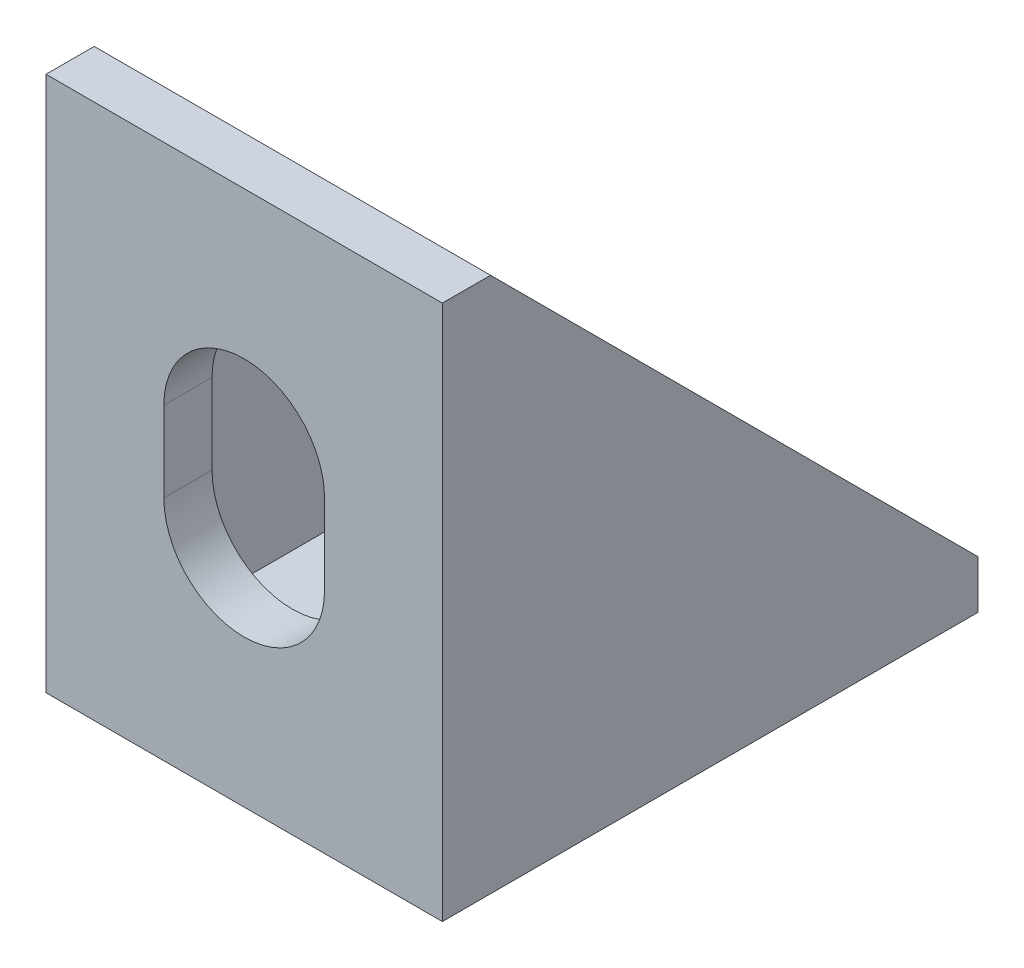
ISO-10303-21;
HEADER;
FILE_DESCRIPTION(('STEP AP214'),'2;1');
FILE_NAME('part.step','',(''),(''),'','','');
FILE_SCHEMA(('AUTOMOTIVE_DESIGN { 1 0 10303 214 1 1 1 1 }'));
ENDSEC;
DATA;
#1=APPLICATION_CONTEXT('core data for automotive mechanical design processes');
#2=APPLICATION_PROTOCOL_DEFINITION('international standard','automotive_design',2000,#1);
#3=PRODUCT_CONTEXT('',#1,'mechanical');
#4=PRODUCT('Part','Part','',(#3));
#5=PRODUCT_RELATED_PRODUCT_CATEGORY('part','',(#4));
#6=PRODUCT_DEFINITION_FORMATION('','',#4);
#7=PRODUCT_DEFINITION_CONTEXT('part definition',#1,'design');
#8=PRODUCT_DEFINITION('design','',#6,#7);
#9=PRODUCT_DEFINITION_SHAPE('','',#8);
#10=(LENGTH_UNIT() NAMED_UNIT(*) SI_UNIT(.MILLI.,.METRE.));
#11=(NAMED_UNIT(*) PLANE_ANGLE_UNIT() SI_UNIT($,.RADIAN.));
#12=(NAMED_UNIT(*) SI_UNIT($,.STERADIAN.) SOLID_ANGLE_UNIT());
#13=UNCERTAINTY_MEASURE_WITH_UNIT(LENGTH_MEASURE(1.E-05),#10,'distance_accuracy_value','');
#14=(GEOMETRIC_REPRESENTATION_CONTEXT(3) GLOBAL_UNCERTAINTY_ASSIGNED_CONTEXT((#13)) GLOBAL_UNIT_ASSIGNED_CONTEXT((#10,
#11,#12)) REPRESENTATION_CONTEXT('',''));
#15=CARTESIAN_POINT('',(0.,0.,0.));
#16=DIRECTION('',(0.,0.,1.));
#17=DIRECTION('',(1.,0.,0.));
#18=AXIS2_PLACEMENT_3D('',#15,#16,#17);
#19=CARTESIAN_POINT('',(0.,1.8,0.));
#20=DIRECTION('',(0.,1.,0.));
#21=DIRECTION('',(0.,0.,-1.));
#22=AXIS2_PLACEMENT_3D('',#19,#20,#21);
#23=PLANE('',#22);
#24=DIRECTION('',(0.,0.,1.));
#25=VECTOR('',#24,1.);
#26=CARTESIAN_POINT('',(13.,1.8,-1.8));
#27=LINE('',#26,#25);
#28=CARTESIAN_POINT('',(13.,1.8,-20.));
#29=VERTEX_POINT('',#28);
#30=CARTESIAN_POINT('',(13.,1.8,-1.8));
#31=VERTEX_POINT('',#30);
#32=EDGE_CURVE('E156',#29,#31,#27,.T.);
#33=ORIENTED_EDGE('',*,*,#32,.F.);
#34=DIRECTION('',(1.,0.,0.));
#35=VECTOR('',#34,1.);
#36=CARTESIAN_POINT('',(0.,1.8,-20.));
#37=LINE('',#36,#35);
#38=CARTESIAN_POINT('',(1.8,1.8,-20.));
#39=VERTEX_POINT('',#38);
#40=EDGE_CURVE('E175',#39,#29,#37,.T.);
#41=ORIENTED_EDGE('',*,*,#40,.F.);
#42=DIRECTION('',(0.,0.,-1.));
#43=VECTOR('',#42,1.);
#44=CARTESIAN_POINT('',(1.8,1.8,-1.8));
#45=LINE('',#44,#43);
#46=CARTESIAN_POINT('',(1.8,1.8,-1.8));
#47=VERTEX_POINT('',#46);
#48=EDGE_CURVE('E195',#47,#39,#45,.T.);
#49=ORIENTED_EDGE('',*,*,#48,.F.);
#50=DIRECTION('',(1.,0.,0.));
#51=VECTOR('',#50,1.);
#52=CARTESIAN_POINT('',(0.,1.8,-1.8));
#53=LINE('',#52,#51);
#54=EDGE_CURVE('E41',#47,#31,#53,.T.);
#55=ORIENTED_EDGE('',*,*,#54,.T.);
#56=EDGE_LOOP('',(#33,#41,#49,#55));
#57=FACE_BOUND('',#56,.T.);
#58=CARTESIAN_POINT('',(7.4,1.8,-11.5));
#59=DIRECTION('',(0.,-1.,0.));
#60=DIRECTION('',(0.,0.,-1.));
#61=AXIS2_PLACEMENT_3D('',#58,#59,#60);
#62=CIRCLE('',#61,3.);
#63=CARTESIAN_POINT('',(4.4,1.80000000000001,-11.5));
#64=VERTEX_POINT('',#63);
#65=CARTESIAN_POINT('',(10.4,1.80000000000001,-11.5));
#66=VERTEX_POINT('',#65);
#67=EDGE_CURVE('E247',#64,#66,#62,.T.);
#68=ORIENTED_EDGE('',*,*,#67,.T.);
#69=DIRECTION('',(0.,0.,1.));
#70=VECTOR('',#69,1.);
#71=CARTESIAN_POINT('',(10.4,1.8,0.));
#72=LINE('',#71,#70);
#73=CARTESIAN_POINT('',(10.4,1.80000000000001,-8.5));
#74=VERTEX_POINT('',#73);
#75=EDGE_CURVE('E244',#66,#74,#72,.T.);
#76=ORIENTED_EDGE('',*,*,#75,.T.);
#77=CARTESIAN_POINT('',(7.4,1.8,-8.5));
#78=DIRECTION('',(0.,-1.,0.));
#79=DIRECTION('',(0.,0.,-1.));
#80=AXIS2_PLACEMENT_3D('',#77,#78,#79);
#81=CIRCLE('',#80,3.);
#82=CARTESIAN_POINT('',(4.4,1.8,-8.5));
#83=VERTEX_POINT('',#82);
#84=EDGE_CURVE('E241',#74,#83,#81,.T.);
#85=ORIENTED_EDGE('',*,*,#84,.T.);
#86=DIRECTION('',(0.,0.,-1.));
#87=VECTOR('',#86,1.);
#88=CARTESIAN_POINT('',(4.4,1.8,0.));
#89=LINE('',#88,#87);
#90=EDGE_CURVE('E233',#83,#64,#89,.T.);
#91=ORIENTED_EDGE('',*,*,#90,.T.);
#92=EDGE_LOOP('',(#68,#76,#85,#91));
#93=FACE_BOUND('',#92,.T.);
#94=ADVANCED_FACE('F37',(#57,#93),#23,.T.);
#95=CARTESIAN_POINT('',(0.,20.,-1.8));
#96=DIRECTION('',(0.,0.,1.));
#97=DIRECTION('',(-1.,0.,0.));
#98=AXIS2_PLACEMENT_3D('',#95,#96,#97);
#99=PLANE('',#98);
#100=DIRECTION('',(0.,1.,0.));
#101=VECTOR('',#100,1.);
#102=CARTESIAN_POINT('',(4.4,20.,-1.8));
#103=LINE('',#102,#101);
#104=CARTESIAN_POINT('',(4.4,8.5,-1.8));
#105=VERTEX_POINT('',#104);
#106=CARTESIAN_POINT('',(4.4,11.5,-1.8));
#107=VERTEX_POINT('',#106);
#108=EDGE_CURVE('E47',#105,#107,#103,.T.);
#109=ORIENTED_EDGE('',*,*,#108,.F.);
#110=CARTESIAN_POINT('',(7.4,8.5,-1.8));
#111=DIRECTION('',(0.,0.,-1.));
#112=DIRECTION('',(-1.,0.,0.));
#113=AXIS2_PLACEMENT_3D('',#110,#111,#112);
#114=CIRCLE('',#113,3.);
#115=CARTESIAN_POINT('',(10.4,8.5,-1.8));
#116=VERTEX_POINT('',#115);
#117=EDGE_CURVE('E285',#116,#105,#114,.T.);
#118=ORIENTED_EDGE('',*,*,#117,.F.);
#119=DIRECTION('',(0.,-1.,0.));
#120=VECTOR('',#119,1.);
#121=CARTESIAN_POINT('',(10.4,20.,-1.8));
#122=LINE('',#121,#120);
#123=CARTESIAN_POINT('',(10.4,11.5,-1.8));
#124=VERTEX_POINT('',#123);
#125=EDGE_CURVE('E282',#124,#116,#122,.T.);
#126=ORIENTED_EDGE('',*,*,#125,.F.);
#127=CARTESIAN_POINT('',(7.4,11.5,-1.8));
#128=DIRECTION('',(0.,0.,-1.));
#129=DIRECTION('',(-1.,0.,0.));
#130=AXIS2_PLACEMENT_3D('',#127,#128,#129);
#131=CIRCLE('',#130,3.);
#132=EDGE_CURVE('E11',#107,#124,#131,.T.);
#133=ORIENTED_EDGE('',*,*,#132,.F.);
#134=EDGE_LOOP('',(#109,#118,#126,#133));
#135=FACE_BOUND('',#134,.T.);
#136=ORIENTED_EDGE('',*,*,#54,.F.);
#137=DIRECTION('',(0.,-1.,0.));
#138=VECTOR('',#137,1.);
#139=CARTESIAN_POINT('',(1.8,20.,-1.8));
#140=LINE('',#139,#138);
#141=CARTESIAN_POINT('',(1.8,20.,-1.8));
#142=VERTEX_POINT('',#141);
#143=EDGE_CURVE('E193',#142,#47,#140,.T.);
#144=ORIENTED_EDGE('',*,*,#143,.F.);
#145=DIRECTION('',(1.,0.,0.));
#146=VECTOR('',#145,1.);
#147=CARTESIAN_POINT('',(0.,20.,-1.8));
#148=LINE('',#147,#146);
#149=CARTESIAN_POINT('',(13.,20.,-1.8));
#150=VERTEX_POINT('',#149);
#151=EDGE_CURVE('E253',#142,#150,#148,.T.);
#152=ORIENTED_EDGE('',*,*,#151,.T.);
#153=DIRECTION('',(0.,1.,0.));
#154=VECTOR('',#153,1.);
#155=CARTESIAN_POINT('',(13.,20.,-1.8));
#156=LINE('',#155,#154);
#157=EDGE_CURVE('E157',#31,#150,#156,.T.);
#158=ORIENTED_EDGE('',*,*,#157,.F.);
#159=EDGE_LOOP('',(#136,#144,#152,#158));
#160=FACE_BOUND('',#159,.T.);
#161=ADVANCED_FACE('F296',(#135,#160),#99,.F.);
#162=CARTESIAN_POINT('',(0.,1.8,0.));
#163=DIRECTION('',(1.,0.,0.));
#164=DIRECTION('',(0.,0.,1.));
#165=AXIS2_PLACEMENT_3D('',#162,#163,#164);
#166=PLANE('',#165);
#167=DIRECTION('',(0.,-1.,0.));
#168=VECTOR('',#167,1.);
#169=CARTESIAN_POINT('',(0.,1.8,-20.));
#170=LINE('',#169,#168);
#171=CARTESIAN_POINT('',(0.,1.8,-20.));
#172=VERTEX_POINT('',#171);
#173=CARTESIAN_POINT('',(0.,0.,-20.));
#174=VERTEX_POINT('',#173);
#175=EDGE_CURVE('E279',#172,#174,#170,.T.);
#176=ORIENTED_EDGE('',*,*,#175,.T.);
#177=DIRECTION('',(0.,0.,-1.));
#178=VECTOR('',#177,1.);
#179=CARTESIAN_POINT('',(0.,0.,0.));
#180=LINE('',#179,#178);
#181=CARTESIAN_POINT('',(0.,0.,0.));
#182=VERTEX_POINT('',#181);
#183=EDGE_CURVE('E260',#182,#174,#180,.T.);
#184=ORIENTED_EDGE('',*,*,#183,.F.);
#185=DIRECTION('',(0.,-1.,0.));
#186=VECTOR('',#185,1.);
#187=CARTESIAN_POINT('',(0.,1.8,0.));
#188=LINE('',#187,#186);
#189=CARTESIAN_POINT('',(0.,20.,0.));
#190=VERTEX_POINT('',#189);
#191=EDGE_CURVE('E263',#190,#182,#188,.T.);
#192=ORIENTED_EDGE('',*,*,#191,.F.);
#193=DIRECTION('',(0.,0.,-1.));
#194=VECTOR('',#193,1.);
#195=CARTESIAN_POINT('',(0.,20.,0.));
#196=LINE('',#195,#194);
#197=CARTESIAN_POINT('',(0.,20.,-1.8));
#198=VERTEX_POINT('',#197);
#199=EDGE_CURVE('E250',#190,#198,#196,.T.);
#200=ORIENTED_EDGE('',*,*,#199,.T.);
#201=DIRECTION('',(0.,0.707106781186547,0.707106781186548));
#202=VECTOR('',#201,1.);
#203=CARTESIAN_POINT('',(0.,1.8,-20.));
#204=LINE('',#203,#202);
#205=EDGE_CURVE('E190',#172,#198,#204,.T.);
#206=ORIENTED_EDGE('',*,*,#205,.F.);
#207=EDGE_LOOP('',(#176,#184,#192,#200,#206));
#208=FACE_BOUND('',#207,.T.);
#209=ADVANCED_FACE('F39',(#208),#166,.F.);
#210=CARTESIAN_POINT('',(0.,1.8,-20.));
#211=DIRECTION('',(0.,0.,1.));
#212=DIRECTION('',(-1.,0.,0.));
#213=AXIS2_PLACEMENT_3D('',#210,#211,#212);
#214=PLANE('',#213);
#215=DIRECTION('',(1.,0.,0.));
#216=VECTOR('',#215,1.);
#217=CARTESIAN_POINT('',(0.,0.,-20.));
#218=LINE('',#217,#216);
#219=CARTESIAN_POINT('',(14.8,0.,-20.));
#220=VERTEX_POINT('',#219);
#221=EDGE_CURVE('E266',#174,#220,#218,.T.);
#222=ORIENTED_EDGE('',*,*,#221,.F.);
#223=ORIENTED_EDGE('',*,*,#175,.F.);
#224=EDGE_CURVE('E178',#172,#39,#37,.T.);
#225=ORIENTED_EDGE('',*,*,#224,.T.);
#226=ORIENTED_EDGE('',*,*,#40,.T.);
#227=DIRECTION('',(1.,0.,0.));
#228=VECTOR('',#227,1.);
#229=CARTESIAN_POINT('',(13.,1.8,-20.));
#230=LINE('',#229,#228);
#231=CARTESIAN_POINT('',(14.8,1.8,-20.));
#232=VERTEX_POINT('',#231);
#233=EDGE_CURVE('E164',#29,#232,#230,.T.);
#234=ORIENTED_EDGE('',*,*,#233,.T.);
#235=DIRECTION('',(0.,-1.,0.));
#236=VECTOR('',#235,1.);
#237=CARTESIAN_POINT('',(14.8,1.8,-20.));
#238=LINE('',#237,#236);
#239=EDGE_CURVE('E277',#232,#220,#238,.T.);
#240=ORIENTED_EDGE('',*,*,#239,.T.);
#241=EDGE_LOOP('',(#222,#223,#225,#226,#234,#240));
#242=FACE_BOUND('',#241,.T.);
#243=ADVANCED_FACE('F176',(#242),#214,.F.);
#244=CARTESIAN_POINT('',(14.8,1.8,0.));
#245=DIRECTION('',(1.,0.,0.));
#246=DIRECTION('',(0.,0.,1.));
#247=AXIS2_PLACEMENT_3D('',#244,#245,#246);
#248=PLANE('',#247);
#249=DIRECTION('',(0.,0.,-1.));
#250=VECTOR('',#249,1.);
#251=CARTESIAN_POINT('',(14.8,0.,0.));
#252=LINE('',#251,#250);
#253=CARTESIAN_POINT('',(14.8,0.,0.));
#254=VERTEX_POINT('',#253);
#255=EDGE_CURVE('E269',#254,#220,#252,.T.);
#256=ORIENTED_EDGE('',*,*,#255,.T.);
#257=ORIENTED_EDGE('',*,*,#239,.F.);
#258=DIRECTION('',(0.,-0.707106781186547,-0.707106781186548));
#259=VECTOR('',#258,1.);
#260=CARTESIAN_POINT('',(14.8,1.8,-20.));
#261=LINE('',#260,#259);
#262=CARTESIAN_POINT('',(14.8,20.,-1.8));
#263=VERTEX_POINT('',#262);
#264=EDGE_CURVE('E161',#263,#232,#261,.T.);
#265=ORIENTED_EDGE('',*,*,#264,.F.);
#266=DIRECTION('',(0.,0.,1.));
#267=VECTOR('',#266,1.);
#268=CARTESIAN_POINT('',(14.8,20.,0.));
#269=LINE('',#268,#267);
#270=CARTESIAN_POINT('',(14.8,20.,0.));
#271=VERTEX_POINT('',#270);
#272=EDGE_CURVE('E256',#263,#271,#269,.T.);
#273=ORIENTED_EDGE('',*,*,#272,.T.);
#274=DIRECTION('',(0.,-1.,0.));
#275=VECTOR('',#274,1.);
#276=CARTESIAN_POINT('',(14.8,1.8,0.));
#277=LINE('',#276,#275);
#278=EDGE_CURVE('E274',#271,#254,#277,.T.);
#279=ORIENTED_EDGE('',*,*,#278,.T.);
#280=EDGE_LOOP('',(#256,#257,#265,#273,#279));
#281=FACE_BOUND('',#280,.T.);
#282=ADVANCED_FACE('F335',(#281),#248,.T.);
#283=CARTESIAN_POINT('',(0.,1.8,0.));
#284=DIRECTION('',(0.,0.,1.));
#285=DIRECTION('',(-1.,0.,0.));
#286=AXIS2_PLACEMENT_3D('',#283,#284,#285);
#287=PLANE('',#286);
#288=CARTESIAN_POINT('',(7.4,11.5,0.));
#289=DIRECTION('',(0.,0.,-1.));
#290=DIRECTION('',(-1.,0.,0.));
#291=AXIS2_PLACEMENT_3D('',#288,#289,#290);
#292=CIRCLE('',#291,3.);
#293=CARTESIAN_POINT('',(4.4,11.5,0.));
#294=VERTEX_POINT('',#293);
#295=CARTESIAN_POINT('',(10.4,11.5,0.));
#296=VERTEX_POINT('',#295);
#297=EDGE_CURVE('E197',#294,#296,#292,.T.);
#298=ORIENTED_EDGE('',*,*,#297,.T.);
#299=DIRECTION('',(0.,-1.,0.));
#300=VECTOR('',#299,1.);
#301=CARTESIAN_POINT('',(10.4,11.5,0.));
#302=LINE('',#301,#300);
#303=CARTESIAN_POINT('',(10.4,8.5,0.));
#304=VERTEX_POINT('',#303);
#305=EDGE_CURVE('E202',#296,#304,#302,.T.);
#306=ORIENTED_EDGE('',*,*,#305,.T.);
#307=CARTESIAN_POINT('',(7.4,8.5,0.));
#308=DIRECTION('',(0.,0.,-1.));
#309=DIRECTION('',(-1.,0.,0.));
#310=AXIS2_PLACEMENT_3D('',#307,#308,#309);
#311=CIRCLE('',#310,3.);
#312=CARTESIAN_POINT('',(4.4,8.5,0.));
#313=VERTEX_POINT('',#312);
#314=EDGE_CURVE('E205',#304,#313,#311,.T.);
#315=ORIENTED_EDGE('',*,*,#314,.T.);
#316=DIRECTION('',(0.,1.,0.));
#317=VECTOR('',#316,1.);
#318=CARTESIAN_POINT('',(4.4,11.5,0.));
#319=LINE('',#318,#317);
#320=EDGE_CURVE('E208',#313,#294,#319,.T.);
#321=ORIENTED_EDGE('',*,*,#320,.T.);
#322=EDGE_LOOP('',(#298,#306,#315,#321));
#323=FACE_BOUND('',#322,.T.);
#324=DIRECTION('',(1.,0.,0.));
#325=VECTOR('',#324,1.);
#326=CARTESIAN_POINT('',(0.,0.,0.));
#327=LINE('',#326,#325);
#328=EDGE_CURVE('E181',#182,#254,#327,.T.);
#329=ORIENTED_EDGE('',*,*,#328,.T.);
#330=ORIENTED_EDGE('',*,*,#278,.F.);
#331=DIRECTION('',(-1.,0.,0.));
#332=VECTOR('',#331,1.);
#333=CARTESIAN_POINT('',(0.,20.,0.));
#334=LINE('',#333,#332);
#335=EDGE_CURVE('E259',#271,#190,#334,.T.);
#336=ORIENTED_EDGE('',*,*,#335,.T.);
#337=ORIENTED_EDGE('',*,*,#191,.T.);
#338=EDGE_LOOP('',(#329,#330,#336,#337));
#339=FACE_BOUND('',#338,.T.);
#340=ADVANCED_FACE('F301',(#323,#339),#287,.T.);
#341=CARTESIAN_POINT('',(0.,0.,0.));
#342=DIRECTION('',(0.,1.,0.));
#343=DIRECTION('',(0.,0.,-1.));
#344=AXIS2_PLACEMENT_3D('',#341,#342,#343);
#345=PLANE('',#344);
#346=DIRECTION('',(0.,0.,1.));
#347=VECTOR('',#346,1.);
#348=CARTESIAN_POINT('',(4.4,0.,-11.5));
#349=LINE('',#348,#347);
#350=CARTESIAN_POINT('',(4.4,0.,-11.5));
#351=VERTEX_POINT('',#350);
#352=CARTESIAN_POINT('',(4.4,0.,-8.5));
#353=VERTEX_POINT('',#352);
#354=EDGE_CURVE('E221',#351,#353,#349,.T.);
#355=ORIENTED_EDGE('',*,*,#354,.T.);
#356=CARTESIAN_POINT('',(7.4,0.,-8.5));
#357=DIRECTION('',(0.,1.,0.));
#358=DIRECTION('',(0.,0.,1.));
#359=AXIS2_PLACEMENT_3D('',#356,#357,#358);
#360=CIRCLE('',#359,3.);
#361=CARTESIAN_POINT('',(10.4,0.,-8.5));
#362=VERTEX_POINT('',#361);
#363=EDGE_CURVE('E224',#353,#362,#360,.T.);
#364=ORIENTED_EDGE('',*,*,#363,.T.);
#365=DIRECTION('',(0.,0.,-1.));
#366=VECTOR('',#365,1.);
#367=CARTESIAN_POINT('',(10.4,0.,-11.5));
#368=LINE('',#367,#366);
#369=CARTESIAN_POINT('',(10.4,0.,-11.5));
#370=VERTEX_POINT('',#369);
#371=EDGE_CURVE('E227',#362,#370,#368,.T.);
#372=ORIENTED_EDGE('',*,*,#371,.T.);
#373=CARTESIAN_POINT('',(7.4,0.,-11.5));
#374=DIRECTION('',(0.,1.,0.));
#375=DIRECTION('',(0.,0.,1.));
#376=AXIS2_PLACEMENT_3D('',#373,#374,#375);
#377=CIRCLE('',#376,3.);
#378=EDGE_CURVE('E213',#370,#351,#377,.T.);
#379=ORIENTED_EDGE('',*,*,#378,.T.);
#380=EDGE_LOOP('',(#355,#364,#372,#379));
#381=FACE_BOUND('',#380,.T.);
#382=ORIENTED_EDGE('',*,*,#183,.T.);
#383=ORIENTED_EDGE('',*,*,#221,.T.);
#384=ORIENTED_EDGE('',*,*,#255,.F.);
#385=ORIENTED_EDGE('',*,*,#328,.F.);
#386=EDGE_LOOP('',(#382,#383,#384,#385));
#387=FACE_BOUND('',#386,.T.);
#388=ADVANCED_FACE('F328',(#381,#387),#345,.F.);
#389=CARTESIAN_POINT('',(0.,20.,0.));
#390=DIRECTION('',(0.,1.,0.));
#391=DIRECTION('',(0.,0.,-1.));
#392=AXIS2_PLACEMENT_3D('',#389,#390,#391);
#393=PLANE('',#392);
#394=ORIENTED_EDGE('',*,*,#199,.F.);
#395=ORIENTED_EDGE('',*,*,#335,.F.);
#396=ORIENTED_EDGE('',*,*,#272,.F.);
#397=DIRECTION('',(1.,0.,0.));
#398=VECTOR('',#397,1.);
#399=CARTESIAN_POINT('',(13.,20.,-1.8));
#400=LINE('',#399,#398);
#401=EDGE_CURVE('E171',#150,#263,#400,.T.);
#402=ORIENTED_EDGE('',*,*,#401,.F.);
#403=ORIENTED_EDGE('',*,*,#151,.F.);
#404=EDGE_CURVE('E254',#198,#142,#148,.T.);
#405=ORIENTED_EDGE('',*,*,#404,.F.);
#406=EDGE_LOOP('',(#394,#395,#396,#402,#403,#405));
#407=FACE_BOUND('',#406,.T.);
#408=ADVANCED_FACE('F331',(#407),#393,.T.);
#409=CARTESIAN_POINT('',(7.4,20.000025,-11.5));
#410=DIRECTION('',(0.,-1.,0.));
#411=DIRECTION('',(0.,0.,1.));
#412=AXIS2_PLACEMENT_3D('',#409,#410,#411);
#413=CYLINDRICAL_SURFACE('',#412,3.);
#414=ORIENTED_EDGE('',*,*,#67,.F.);
#415=DIRECTION('',(0.,-1.,0.));
#416=VECTOR('',#415,1.);
#417=CARTESIAN_POINT('',(4.4,20.000025,-11.5));
#418=LINE('',#417,#416);
#419=EDGE_CURVE('E230',#64,#351,#418,.T.);
#420=ORIENTED_EDGE('',*,*,#419,.T.);
#421=ORIENTED_EDGE('',*,*,#378,.F.);
#422=DIRECTION('',(0.,-1.,0.));
#423=VECTOR('',#422,1.);
#424=CARTESIAN_POINT('',(10.4,20.000025,-11.5));
#425=LINE('',#424,#423);
#426=EDGE_CURVE('E231',#66,#370,#425,.T.);
#427=ORIENTED_EDGE('',*,*,#426,.F.);
#428=EDGE_LOOP('',(#414,#420,#421,#427));
#429=FACE_BOUND('',#428,.T.);
#430=ADVANCED_FACE('F379',(#429),#413,.F.);
#431=CARTESIAN_POINT('',(10.4,20.000025,-11.5));
#432=DIRECTION('',(1.,0.,0.));
#433=DIRECTION('',(0.,0.,1.));
#434=AXIS2_PLACEMENT_3D('',#431,#432,#433);
#435=PLANE('',#434);
#436=ORIENTED_EDGE('',*,*,#75,.F.);
#437=ORIENTED_EDGE('',*,*,#426,.T.);
#438=ORIENTED_EDGE('',*,*,#371,.F.);
#439=DIRECTION('',(0.,-1.,0.));
#440=VECTOR('',#439,1.);
#441=CARTESIAN_POINT('',(10.4,20.000025,-8.5));
#442=LINE('',#441,#440);
#443=EDGE_CURVE('E234',#74,#362,#442,.T.);
#444=ORIENTED_EDGE('',*,*,#443,.F.);
#445=EDGE_LOOP('',(#436,#437,#438,#444));
#446=FACE_BOUND('',#445,.T.);
#447=ADVANCED_FACE('F376',(#446),#435,.F.);
#448=CARTESIAN_POINT('',(7.4,20.000025,-8.5));
#449=DIRECTION('',(0.,-1.,0.));
#450=DIRECTION('',(0.,0.,1.));
#451=AXIS2_PLACEMENT_3D('',#448,#449,#450);
#452=CYLINDRICAL_SURFACE('',#451,3.);
#453=ORIENTED_EDGE('',*,*,#84,.F.);
#454=ORIENTED_EDGE('',*,*,#443,.T.);
#455=ORIENTED_EDGE('',*,*,#363,.F.);
#456=DIRECTION('',(0.,-1.,0.));
#457=VECTOR('',#456,1.);
#458=CARTESIAN_POINT('',(4.4,20.000025,-8.5));
#459=LINE('',#458,#457);
#460=EDGE_CURVE('E236',#83,#353,#459,.T.);
#461=ORIENTED_EDGE('',*,*,#460,.F.);
#462=EDGE_LOOP('',(#453,#454,#455,#461));
#463=FACE_BOUND('',#462,.T.);
#464=ADVANCED_FACE('F372',(#463),#452,.F.);
#465=CARTESIAN_POINT('',(4.4,20.000025,-11.5));
#466=DIRECTION('',(-1.,0.,0.));
#467=DIRECTION('',(0.,0.,-1.));
#468=AXIS2_PLACEMENT_3D('',#465,#466,#467);
#469=PLANE('',#468);
#470=ORIENTED_EDGE('',*,*,#90,.F.);
#471=ORIENTED_EDGE('',*,*,#460,.T.);
#472=ORIENTED_EDGE('',*,*,#354,.F.);
#473=ORIENTED_EDGE('',*,*,#419,.F.);
#474=EDGE_LOOP('',(#470,#471,#472,#473));
#475=FACE_BOUND('',#474,.T.);
#476=ADVANCED_FACE('F368',(#475),#469,.F.);
#477=CARTESIAN_POINT('',(7.4,11.5,-17.2));
#478=DIRECTION('',(0.,0.,1.));
#479=DIRECTION('',(-1.,0.,0.));
#480=AXIS2_PLACEMENT_3D('',#477,#478,#479);
#481=CYLINDRICAL_SURFACE('',#480,3.);
#482=DIRECTION('',(0.,0.,1.));
#483=VECTOR('',#482,1.);
#484=CARTESIAN_POINT('',(4.4,11.5,-17.2));
#485=LINE('',#484,#483);
#486=EDGE_CURVE('E211',#107,#294,#485,.T.);
#487=ORIENTED_EDGE('',*,*,#486,.F.);
#488=ORIENTED_EDGE('',*,*,#132,.T.);
#489=DIRECTION('',(0.,0.,1.));
#490=VECTOR('',#489,1.);
#491=CARTESIAN_POINT('',(10.4,11.5,-17.2));
#492=LINE('',#491,#490);
#493=EDGE_CURVE('E61',#124,#296,#492,.T.);
#494=ORIENTED_EDGE('',*,*,#493,.T.);
#495=ORIENTED_EDGE('',*,*,#297,.F.);
#496=EDGE_LOOP('',(#487,#488,#494,#495));
#497=FACE_BOUND('',#496,.T.);
#498=ADVANCED_FACE('F299',(#497),#481,.F.);
#499=CARTESIAN_POINT('',(4.4,11.5,-17.2));
#500=DIRECTION('',(-1.,0.,0.));
#501=DIRECTION('',(0.,-1.,0.));
#502=AXIS2_PLACEMENT_3D('',#499,#500,#501);
#503=PLANE('',#502);
#504=DIRECTION('',(0.,0.,1.));
#505=VECTOR('',#504,1.);
#506=CARTESIAN_POINT('',(4.4,8.5,-17.2));
#507=LINE('',#506,#505);
#508=EDGE_CURVE('E214',#105,#313,#507,.T.);
#509=ORIENTED_EDGE('',*,*,#508,.F.);
#510=ORIENTED_EDGE('',*,*,#108,.T.);
#511=ORIENTED_EDGE('',*,*,#486,.T.);
#512=ORIENTED_EDGE('',*,*,#320,.F.);
#513=EDGE_LOOP('',(#509,#510,#511,#512));
#514=FACE_BOUND('',#513,.T.);
#515=ADVANCED_FACE('F291',(#514),#503,.F.);
#516=CARTESIAN_POINT('',(7.4,8.5,-17.2));
#517=DIRECTION('',(0.,0.,1.));
#518=DIRECTION('',(-1.,0.,0.));
#519=AXIS2_PLACEMENT_3D('',#516,#517,#518);
#520=CYLINDRICAL_SURFACE('',#519,3.);
#521=DIRECTION('',(0.,0.,1.));
#522=VECTOR('',#521,1.);
#523=CARTESIAN_POINT('',(10.4,8.5,-17.2));
#524=LINE('',#523,#522);
#525=EDGE_CURVE('E216',#116,#304,#524,.T.);
#526=ORIENTED_EDGE('',*,*,#525,.F.);
#527=ORIENTED_EDGE('',*,*,#117,.T.);
#528=ORIENTED_EDGE('',*,*,#508,.T.);
#529=ORIENTED_EDGE('',*,*,#314,.F.);
#530=EDGE_LOOP('',(#526,#527,#528,#529));
#531=FACE_BOUND('',#530,.T.);
#532=ADVANCED_FACE('F305',(#531),#520,.F.);
#533=CARTESIAN_POINT('',(10.4,11.5,-17.2));
#534=DIRECTION('',(1.,0.,0.));
#535=DIRECTION('',(0.,1.,0.));
#536=AXIS2_PLACEMENT_3D('',#533,#534,#535);
#537=PLANE('',#536);
#538=ORIENTED_EDGE('',*,*,#493,.F.);
#539=ORIENTED_EDGE('',*,*,#125,.T.);
#540=ORIENTED_EDGE('',*,*,#525,.T.);
#541=ORIENTED_EDGE('',*,*,#305,.F.);
#542=EDGE_LOOP('',(#538,#539,#540,#541));
#543=FACE_BOUND('',#542,.T.);
#544=ADVANCED_FACE('F307',(#543),#537,.F.);
#545=CARTESIAN_POINT('',(1.8,1.8,-20.));
#546=DIRECTION('',(0.,0.707106781186548,-0.707106781186547));
#547=DIRECTION('',(0.,-0.707106781186547,-0.707106781186548));
#548=AXIS2_PLACEMENT_3D('',#545,#546,#547);
#549=PLANE('',#548);
#550=ORIENTED_EDGE('',*,*,#205,.T.);
#551=ORIENTED_EDGE('',*,*,#404,.T.);
#552=DIRECTION('',(0.,0.707106781186547,0.707106781186548));
#553=VECTOR('',#552,1.);
#554=CARTESIAN_POINT('',(1.8,1.8,-20.));
#555=LINE('',#554,#553);
#556=EDGE_CURVE('E54',#39,#142,#555,.T.);
#557=ORIENTED_EDGE('',*,*,#556,.F.);
#558=ORIENTED_EDGE('',*,*,#224,.F.);
#559=EDGE_LOOP('',(#550,#551,#557,#558));
#560=FACE_BOUND('',#559,.T.);
#561=ADVANCED_FACE('F309',(#560),#549,.T.);
#562=CARTESIAN_POINT('',(1.8,0.,0.));
#563=DIRECTION('',(-1.,0.,0.));
#564=DIRECTION('',(0.,0.,-1.));
#565=AXIS2_PLACEMENT_3D('',#562,#563,#564);
#566=PLANE('',#565);
#567=ORIENTED_EDGE('',*,*,#556,.T.);
#568=ORIENTED_EDGE('',*,*,#143,.T.);
#569=ORIENTED_EDGE('',*,*,#48,.T.);
#570=EDGE_LOOP('',(#567,#568,#569));
#571=FACE_BOUND('',#570,.T.);
#572=ADVANCED_FACE('F315',(#571),#566,.F.);
#573=CARTESIAN_POINT('',(13.,1.8,-20.));
#574=DIRECTION('',(0.,0.707106781186548,-0.707106781186547));
#575=DIRECTION('',(0.,-0.707106781186547,-0.707106781186548));
#576=AXIS2_PLACEMENT_3D('',#573,#574,#575);
#577=PLANE('',#576);
#578=ORIENTED_EDGE('',*,*,#264,.T.);
#579=ORIENTED_EDGE('',*,*,#233,.F.);
#580=DIRECTION('',(0.,-0.707106781186547,-0.707106781186548));
#581=VECTOR('',#580,1.);
#582=CARTESIAN_POINT('',(13.,1.8,-20.));
#583=LINE('',#582,#581);
#584=EDGE_CURVE('E152',#150,#29,#583,.T.);
#585=ORIENTED_EDGE('',*,*,#584,.F.);
#586=ORIENTED_EDGE('',*,*,#401,.T.);
#587=EDGE_LOOP('',(#578,#579,#585,#586));
#588=FACE_BOUND('',#587,.T.);
#589=ADVANCED_FACE('F166',(#588),#577,.T.);
#590=CARTESIAN_POINT('',(13.,0.,0.));
#591=DIRECTION('',(-1.,0.,0.));
#592=DIRECTION('',(0.,0.,-1.));
#593=AXIS2_PLACEMENT_3D('',#590,#591,#592);
#594=PLANE('',#593);
#595=ORIENTED_EDGE('',*,*,#584,.T.);
#596=ORIENTED_EDGE('',*,*,#32,.T.);
#597=ORIENTED_EDGE('',*,*,#157,.T.);
#598=EDGE_LOOP('',(#595,#596,#597));
#599=FACE_BOUND('',#598,.T.);
#600=ADVANCED_FACE('F154',(#599),#594,.T.);
#601=CLOSED_SHELL('',(#94,#161,#209,#243,#282,#340,#388,#408,#430,#447,#464,#476,#498,#515,#532,
#544,#561,#572,#589,#600));
#602=MANIFOLD_SOLID_BREP('B2',#601);
#603=ADVANCED_BREP_SHAPE_REPRESENTATION('',(#18,#602),#14);
#604=SHAPE_DEFINITION_REPRESENTATION(#9,#603);
ENDSEC;
END-ISO-10303-21;
